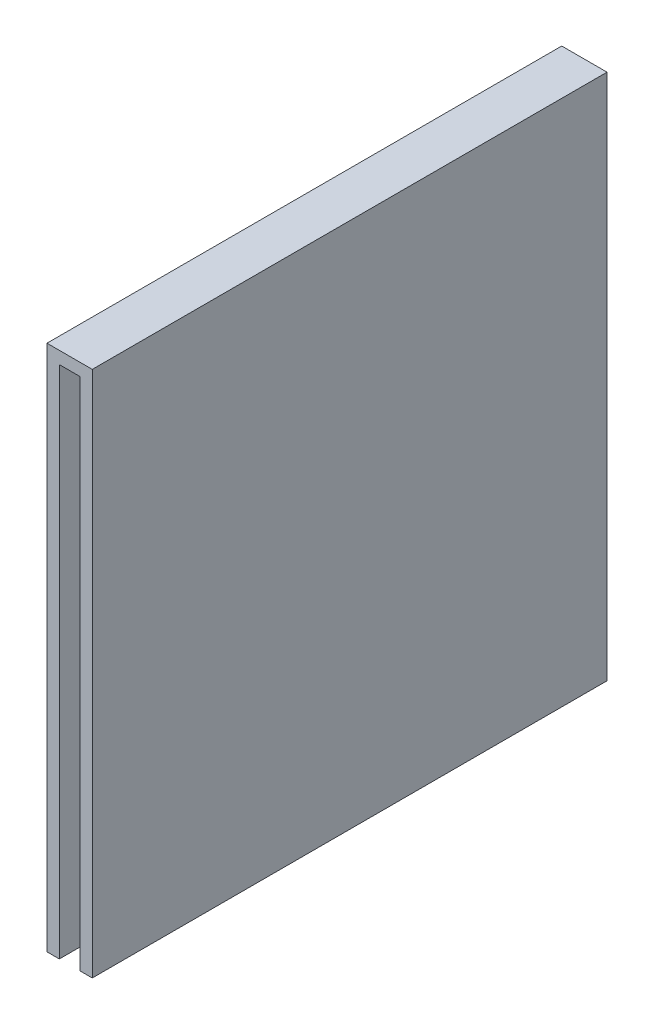
ISO-10303-21;
HEADER;
FILE_DESCRIPTION(('STEP AP214'),'2;1');
FILE_NAME('part.step','',(''),(''),'','','');
FILE_SCHEMA(('AUTOMOTIVE_DESIGN { 1 0 10303 214 1 1 1 1 }'));
ENDSEC;
DATA;
#1=APPLICATION_CONTEXT('core data for automotive mechanical design processes');
#2=APPLICATION_PROTOCOL_DEFINITION('international standard','automotive_design',2000,#1);
#3=PRODUCT_CONTEXT('',#1,'mechanical');
#4=PRODUCT('Part','Part','',(#3));
#5=PRODUCT_RELATED_PRODUCT_CATEGORY('part','',(#4));
#6=PRODUCT_DEFINITION_FORMATION('','',#4);
#7=PRODUCT_DEFINITION_CONTEXT('part definition',#1,'design');
#8=PRODUCT_DEFINITION('design','',#6,#7);
#9=PRODUCT_DEFINITION_SHAPE('','',#8);
#10=(LENGTH_UNIT() NAMED_UNIT(*) SI_UNIT(.MILLI.,.METRE.));
#11=(NAMED_UNIT(*) PLANE_ANGLE_UNIT() SI_UNIT($,.RADIAN.));
#12=(NAMED_UNIT(*) SI_UNIT($,.STERADIAN.) SOLID_ANGLE_UNIT());
#13=UNCERTAINTY_MEASURE_WITH_UNIT(LENGTH_MEASURE(1.E-05),#10,'distance_accuracy_value','');
#14=(GEOMETRIC_REPRESENTATION_CONTEXT(3) GLOBAL_UNCERTAINTY_ASSIGNED_CONTEXT((#13)) GLOBAL_UNIT_ASSIGNED_CONTEXT((#10,
#11,#12)) REPRESENTATION_CONTEXT('',''));
#15=CARTESIAN_POINT('',(0.,0.,0.));
#16=DIRECTION('',(0.,0.,1.));
#17=DIRECTION('',(1.,0.,0.));
#18=AXIS2_PLACEMENT_3D('',#15,#16,#17);
#19=CARTESIAN_POINT('',(-15.5104215571205,-19.5120892018779,12.4999999999999));
#20=DIRECTION('',(0.,1.,0.));
#21=DIRECTION('',(0.,0.,0.999999999999997));
#22=AXIS2_PLACEMENT_3D('',#19,#20,#21);
#23=PLANE('',#22);
#24=DIRECTION('',(1.,0.,0.));
#25=VECTOR('',#24,1.);
#26=CARTESIAN_POINT('',(-15.5104215571205,-19.5120892018779,-1.11022302462516E-13));
#27=LINE('',#26,#25);
#28=CARTESIAN_POINT('',(-15.8104215571205,-19.5120892018779,-1.11022302462516E-13));
#29=VERTEX_POINT('',#28);
#30=CARTESIAN_POINT('',(-15.5104215571205,-19.5120892018779,-1.11022302462516E-13));
#31=VERTEX_POINT('',#30);
#32=EDGE_CURVE('E128',#29,#31,#27,.T.);
#33=ORIENTED_EDGE('',*,*,#32,.T.);
#34=DIRECTION('',(0.,0.,-0.999999999999997));
#35=VECTOR('',#34,1.);
#36=CARTESIAN_POINT('',(-15.5104215571205,-19.5120892018779,12.4999999999999));
#37=LINE('',#36,#35);
#38=CARTESIAN_POINT('',(-15.5104215571205,-19.5120892018779,12.4999999999999));
#39=VERTEX_POINT('',#38);
#40=EDGE_CURVE('E11',#39,#31,#37,.T.);
#41=ORIENTED_EDGE('',*,*,#40,.F.);
#42=DIRECTION('',(1.,0.,0.));
#43=VECTOR('',#42,1.);
#44=CARTESIAN_POINT('',(-15.5104215571205,-19.5120892018779,12.4999999999999));
#45=LINE('',#44,#43);
#46=CARTESIAN_POINT('',(-15.8104215571205,-19.5120892018779,12.4999999999999));
#47=VERTEX_POINT('',#46);
#48=EDGE_CURVE('E142',#47,#39,#45,.T.);
#49=ORIENTED_EDGE('',*,*,#48,.F.);
#50=DIRECTION('',(0.,0.,-0.999999999999997));
#51=VECTOR('',#50,1.);
#52=CARTESIAN_POINT('',(-15.8104215571205,-19.5120892018779,12.4999999999999));
#53=LINE('',#52,#51);
#54=EDGE_CURVE('E124',#47,#29,#53,.T.);
#55=ORIENTED_EDGE('',*,*,#54,.T.);
#56=EDGE_LOOP('',(#33,#41,#49,#55));
#57=FACE_BOUND('',#56,.T.);
#58=ADVANCED_FACE('F32',(#57),#23,.F.);
#59=CARTESIAN_POINT('',(-15.5104215571205,-19.5120892018779,12.4999999999999));
#60=DIRECTION('',(-1.,0.,0.));
#61=DIRECTION('',(0.,0.,0.999999999999997));
#62=AXIS2_PLACEMENT_3D('',#59,#60,#61);
#63=PLANE('',#62);
#64=DIRECTION('',(0.,1.,0.));
#65=VECTOR('',#64,1.);
#66=CARTESIAN_POINT('',(-15.5104215571205,-19.5120892018779,-1.11022302462516E-13));
#67=LINE('',#66,#65);
#68=CARTESIAN_POINT('',(-15.5104215571205,-7.01208920187795,0.));
#69=VERTEX_POINT('',#68);
#70=EDGE_CURVE('E131',#31,#69,#67,.T.);
#71=ORIENTED_EDGE('',*,*,#70,.T.);
#72=DIRECTION('',(0.,0.,-0.999999999999997));
#73=VECTOR('',#72,1.);
#74=CARTESIAN_POINT('',(-15.5104215571205,-7.01208920187795,12.5));
#75=LINE('',#74,#73);
#76=CARTESIAN_POINT('',(-15.5104215571205,-7.01208920187795,12.5));
#77=VERTEX_POINT('',#76);
#78=EDGE_CURVE('E40',#77,#69,#75,.T.);
#79=ORIENTED_EDGE('',*,*,#78,.F.);
#80=DIRECTION('',(0.,1.,0.));
#81=VECTOR('',#80,1.);
#82=CARTESIAN_POINT('',(-15.5104215571205,-19.5120892018779,12.4999999999999));
#83=LINE('',#82,#81);
#84=EDGE_CURVE('E91',#39,#77,#83,.T.);
#85=ORIENTED_EDGE('',*,*,#84,.F.);
#86=ORIENTED_EDGE('',*,*,#40,.T.);
#87=EDGE_LOOP('',(#71,#79,#85,#86));
#88=FACE_BOUND('',#87,.T.);
#89=ADVANCED_FACE('F177',(#88),#63,.F.);
#90=CARTESIAN_POINT('',(-15.5104215571205,-7.01208920187795,12.5));
#91=DIRECTION('',(0.,1.,0.));
#92=DIRECTION('',(0.,0.,0.999999999999997));
#93=AXIS2_PLACEMENT_3D('',#90,#91,#92);
#94=PLANE('',#93);
#95=DIRECTION('',(1.,0.,0.));
#96=VECTOR('',#95,1.);
#97=CARTESIAN_POINT('',(-15.5104215571205,-7.01208920187795,0.));
#98=LINE('',#97,#96);
#99=CARTESIAN_POINT('',(-15.0104215571205,-7.01208920187794,0.));
#100=VERTEX_POINT('',#99);
#101=EDGE_CURVE('E133',#69,#100,#98,.T.);
#102=ORIENTED_EDGE('',*,*,#101,.T.);
#103=DIRECTION('',(0.,0.,-0.999999999999997));
#104=VECTOR('',#103,1.);
#105=CARTESIAN_POINT('',(-15.0104215571205,-7.01208920187794,12.5));
#106=LINE('',#105,#104);
#107=CARTESIAN_POINT('',(-15.0104215571205,-7.01208920187794,12.5));
#108=VERTEX_POINT('',#107);
#109=EDGE_CURVE('E149',#108,#100,#106,.T.);
#110=ORIENTED_EDGE('',*,*,#109,.F.);
#111=DIRECTION('',(1.,0.,0.));
#112=VECTOR('',#111,1.);
#113=CARTESIAN_POINT('',(-15.5104215571205,-7.01208920187795,12.5));
#114=LINE('',#113,#112);
#115=EDGE_CURVE('E157',#77,#108,#114,.T.);
#116=ORIENTED_EDGE('',*,*,#115,.F.);
#117=ORIENTED_EDGE('',*,*,#78,.T.);
#118=EDGE_LOOP('',(#102,#110,#116,#117));
#119=FACE_BOUND('',#118,.T.);
#120=ADVANCED_FACE('F155',(#119),#94,.F.);
#121=CARTESIAN_POINT('',(-15.0104215571205,-7.01208920187794,12.5));
#122=DIRECTION('',(1.,0.,0.));
#123=DIRECTION('',(0.,0.,-0.999999999999997));
#124=AXIS2_PLACEMENT_3D('',#121,#122,#123);
#125=PLANE('',#124);
#126=DIRECTION('',(0.,-1.,0.));
#127=VECTOR('',#126,1.);
#128=CARTESIAN_POINT('',(-15.0104215571205,-7.01208920187794,0.));
#129=LINE('',#128,#127);
#130=CARTESIAN_POINT('',(-15.0104215571205,-19.5120892018779,0.));
#131=VERTEX_POINT('',#130);
#132=EDGE_CURVE('E135',#100,#131,#129,.T.);
#133=ORIENTED_EDGE('',*,*,#132,.T.);
#134=DIRECTION('',(0.,0.,-0.999999999999997));
#135=VECTOR('',#134,1.);
#136=CARTESIAN_POINT('',(-15.0104215571205,-19.5120892018779,12.4999999999999));
#137=LINE('',#136,#135);
#138=CARTESIAN_POINT('',(-15.0104215571205,-19.5120892018779,12.4999999999999));
#139=VERTEX_POINT('',#138);
#140=EDGE_CURVE('E146',#139,#131,#137,.T.);
#141=ORIENTED_EDGE('',*,*,#140,.F.);
#142=DIRECTION('',(0.,-1.,0.));
#143=VECTOR('',#142,1.);
#144=CARTESIAN_POINT('',(-15.0104215571205,-7.01208920187794,12.5));
#145=LINE('',#144,#143);
#146=EDGE_CURVE('E169',#108,#139,#145,.T.);
#147=ORIENTED_EDGE('',*,*,#146,.F.);
#148=ORIENTED_EDGE('',*,*,#109,.T.);
#149=EDGE_LOOP('',(#133,#141,#147,#148));
#150=FACE_BOUND('',#149,.T.);
#151=ADVANCED_FACE('F165',(#150),#125,.F.);
#152=CARTESIAN_POINT('',(-15.0104215571205,-19.5120892018779,12.4999999999999));
#153=DIRECTION('',(0.,1.,0.));
#154=DIRECTION('',(0.,0.,0.999999999999997));
#155=AXIS2_PLACEMENT_3D('',#152,#153,#154);
#156=PLANE('',#155);
#157=DIRECTION('',(1.,0.,0.));
#158=VECTOR('',#157,1.);
#159=CARTESIAN_POINT('',(-15.0104215571205,-19.5120892018779,0.));
#160=LINE('',#159,#158);
#161=CARTESIAN_POINT('',(-14.7104215571205,-19.5120892018779,0.));
#162=VERTEX_POINT('',#161);
#163=EDGE_CURVE('E137',#131,#162,#160,.T.);
#164=ORIENTED_EDGE('',*,*,#163,.T.);
#165=DIRECTION('',(0.,0.,-0.999999999999997));
#166=VECTOR('',#165,1.);
#167=CARTESIAN_POINT('',(-14.7104215571205,-19.5120892018779,12.4999999999999));
#168=LINE('',#167,#166);
#169=CARTESIAN_POINT('',(-14.7104215571205,-19.5120892018779,12.4999999999999));
#170=VERTEX_POINT('',#169);
#171=EDGE_CURVE('E119',#170,#162,#168,.T.);
#172=ORIENTED_EDGE('',*,*,#171,.F.);
#173=DIRECTION('',(1.,0.,0.));
#174=VECTOR('',#173,1.);
#175=CARTESIAN_POINT('',(-15.0104215571205,-19.5120892018779,12.4999999999999));
#176=LINE('',#175,#174);
#177=EDGE_CURVE('E110',#139,#170,#176,.T.);
#178=ORIENTED_EDGE('',*,*,#177,.F.);
#179=ORIENTED_EDGE('',*,*,#140,.T.);
#180=EDGE_LOOP('',(#164,#172,#178,#179));
#181=FACE_BOUND('',#180,.T.);
#182=ADVANCED_FACE('F168',(#181),#156,.F.);
#183=CARTESIAN_POINT('',(-14.7104215571205,-6.71208920187794,12.5));
#184=DIRECTION('',(-1.,0.,0.));
#185=DIRECTION('',(0.,0.,0.999999999999997));
#186=AXIS2_PLACEMENT_3D('',#183,#184,#185);
#187=PLANE('',#186);
#188=DIRECTION('',(0.,1.,0.));
#189=VECTOR('',#188,1.);
#190=CARTESIAN_POINT('',(-14.7104215571205,-6.71208920187795,-1.11022302462516E-13));
#191=LINE('',#190,#189);
#192=CARTESIAN_POINT('',(-14.7104215571205,-6.71208920187795,-1.11022302462516E-13));
#193=VERTEX_POINT('',#192);
#194=EDGE_CURVE('E118',#162,#193,#191,.T.);
#195=ORIENTED_EDGE('',*,*,#194,.T.);
#196=DIRECTION('',(0.,0.,-0.999999999999997));
#197=VECTOR('',#196,1.);
#198=CARTESIAN_POINT('',(-14.7104215571205,-6.71208920187794,12.5));
#199=LINE('',#198,#197);
#200=CARTESIAN_POINT('',(-14.7104215571205,-6.71208920187794,12.5));
#201=VERTEX_POINT('',#200);
#202=EDGE_CURVE('E115',#201,#193,#199,.T.);
#203=ORIENTED_EDGE('',*,*,#202,.F.);
#204=DIRECTION('',(0.,1.,0.));
#205=VECTOR('',#204,1.);
#206=CARTESIAN_POINT('',(-14.7104215571205,-6.71208920187794,12.5));
#207=LINE('',#206,#205);
#208=EDGE_CURVE('E104',#170,#201,#207,.T.);
#209=ORIENTED_EDGE('',*,*,#208,.F.);
#210=ORIENTED_EDGE('',*,*,#171,.T.);
#211=EDGE_LOOP('',(#195,#203,#209,#210));
#212=FACE_BOUND('',#211,.T.);
#213=ADVANCED_FACE('F116',(#212),#187,.F.);
#214=CARTESIAN_POINT('',(-15.8104215571205,-6.71208920187795,12.4999999999999));
#215=DIRECTION('',(0.,-1.,0.));
#216=DIRECTION('',(0.,0.,-0.999999999999997));
#217=AXIS2_PLACEMENT_3D('',#214,#215,#216);
#218=PLANE('',#217);
#219=DIRECTION('',(-1.,0.,0.));
#220=VECTOR('',#219,1.);
#221=CARTESIAN_POINT('',(-15.8104215571205,-6.71208920187796,-1.11022302462516E-13));
#222=LINE('',#221,#220);
#223=CARTESIAN_POINT('',(-15.8104215571205,-6.71208920187796,-1.11022302462516E-13));
#224=VERTEX_POINT('',#223);
#225=EDGE_CURVE('E77',#193,#224,#222,.T.);
#226=ORIENTED_EDGE('',*,*,#225,.T.);
#227=DIRECTION('',(0.,0.,-0.999999999999997));
#228=VECTOR('',#227,1.);
#229=CARTESIAN_POINT('',(-15.8104215571205,-6.71208920187795,12.4999999999999));
#230=LINE('',#229,#228);
#231=CARTESIAN_POINT('',(-15.8104215571205,-6.71208920187795,12.4999999999999));
#232=VERTEX_POINT('',#231);
#233=EDGE_CURVE('E120',#232,#224,#230,.T.);
#234=ORIENTED_EDGE('',*,*,#233,.F.);
#235=DIRECTION('',(-1.,0.,0.));
#236=VECTOR('',#235,1.);
#237=CARTESIAN_POINT('',(-15.8104215571205,-6.71208920187795,12.4999999999999));
#238=LINE('',#237,#236);
#239=EDGE_CURVE('E108',#201,#232,#238,.T.);
#240=ORIENTED_EDGE('',*,*,#239,.F.);
#241=ORIENTED_EDGE('',*,*,#202,.T.);
#242=EDGE_LOOP('',(#226,#234,#240,#241));
#243=FACE_BOUND('',#242,.T.);
#244=ADVANCED_FACE('F122',(#243),#218,.F.);
#245=CARTESIAN_POINT('',(-15.8104215571205,-6.71208920187795,12.4999999999999));
#246=DIRECTION('',(1.,0.,0.));
#247=DIRECTION('',(0.,0.,-0.999999999999997));
#248=AXIS2_PLACEMENT_3D('',#245,#246,#247);
#249=PLANE('',#248);
#250=DIRECTION('',(0.,-1.,0.));
#251=VECTOR('',#250,1.);
#252=CARTESIAN_POINT('',(-15.8104215571205,-6.71208920187796,-1.11022302462516E-13));
#253=LINE('',#252,#251);
#254=EDGE_CURVE('E83',#224,#29,#253,.T.);
#255=ORIENTED_EDGE('',*,*,#254,.T.);
#256=ORIENTED_EDGE('',*,*,#54,.F.);
#257=DIRECTION('',(0.,-1.,0.));
#258=VECTOR('',#257,1.);
#259=CARTESIAN_POINT('',(-15.8104215571205,-6.71208920187795,12.4999999999999));
#260=LINE('',#259,#258);
#261=EDGE_CURVE('E48',#232,#47,#260,.T.);
#262=ORIENTED_EDGE('',*,*,#261,.F.);
#263=ORIENTED_EDGE('',*,*,#233,.T.);
#264=EDGE_LOOP('',(#255,#256,#262,#263));
#265=FACE_BOUND('',#264,.T.);
#266=ADVANCED_FACE('F193',(#265),#249,.F.);
#267=CARTESIAN_POINT('',(-15.8104215571205,-19.5120892018779,12.4999999999999));
#268=DIRECTION('',(0.,0.,0.999999999999997));
#269=DIRECTION('',(1.,0.,0.));
#270=AXIS2_PLACEMENT_3D('',#267,#268,#269);
#271=PLANE('',#270);
#272=ORIENTED_EDGE('',*,*,#48,.T.);
#273=ORIENTED_EDGE('',*,*,#84,.T.);
#274=ORIENTED_EDGE('',*,*,#115,.T.);
#275=ORIENTED_EDGE('',*,*,#146,.T.);
#276=ORIENTED_EDGE('',*,*,#177,.T.);
#277=ORIENTED_EDGE('',*,*,#208,.T.);
#278=ORIENTED_EDGE('',*,*,#239,.T.);
#279=ORIENTED_EDGE('',*,*,#261,.T.);
#280=EDGE_LOOP('',(#272,#273,#274,#275,#276,#277,#278,#279));
#281=FACE_BOUND('',#280,.T.);
#282=ADVANCED_FACE('F106',(#281),#271,.T.);
#283=CARTESIAN_POINT('',(-15.8104215571205,-19.5120892018779,-1.11022302462516E-13));
#284=DIRECTION('',(0.,0.,0.999999999999997));
#285=DIRECTION('',(1.,0.,0.));
#286=AXIS2_PLACEMENT_3D('',#283,#284,#285);
#287=PLANE('',#286);
#288=ORIENTED_EDGE('',*,*,#32,.F.);
#289=ORIENTED_EDGE('',*,*,#254,.F.);
#290=ORIENTED_EDGE('',*,*,#225,.F.);
#291=ORIENTED_EDGE('',*,*,#194,.F.);
#292=ORIENTED_EDGE('',*,*,#163,.F.);
#293=ORIENTED_EDGE('',*,*,#132,.F.);
#294=ORIENTED_EDGE('',*,*,#101,.F.);
#295=ORIENTED_EDGE('',*,*,#70,.F.);
#296=EDGE_LOOP('',(#288,#289,#290,#291,#292,#293,#294,#295));
#297=FACE_BOUND('',#296,.T.);
#298=ADVANCED_FACE('F161',(#297),#287,.F.);
#299=CLOSED_SHELL('',(#58,#89,#120,#151,#182,#213,#244,#266,#282,#298));
#300=MANIFOLD_SOLID_BREP('B2',#299);
#301=ADVANCED_BREP_SHAPE_REPRESENTATION('',(#18,#300),#14);
#302=SHAPE_DEFINITION_REPRESENTATION(#9,#301);
ENDSEC;
END-ISO-10303-21;
